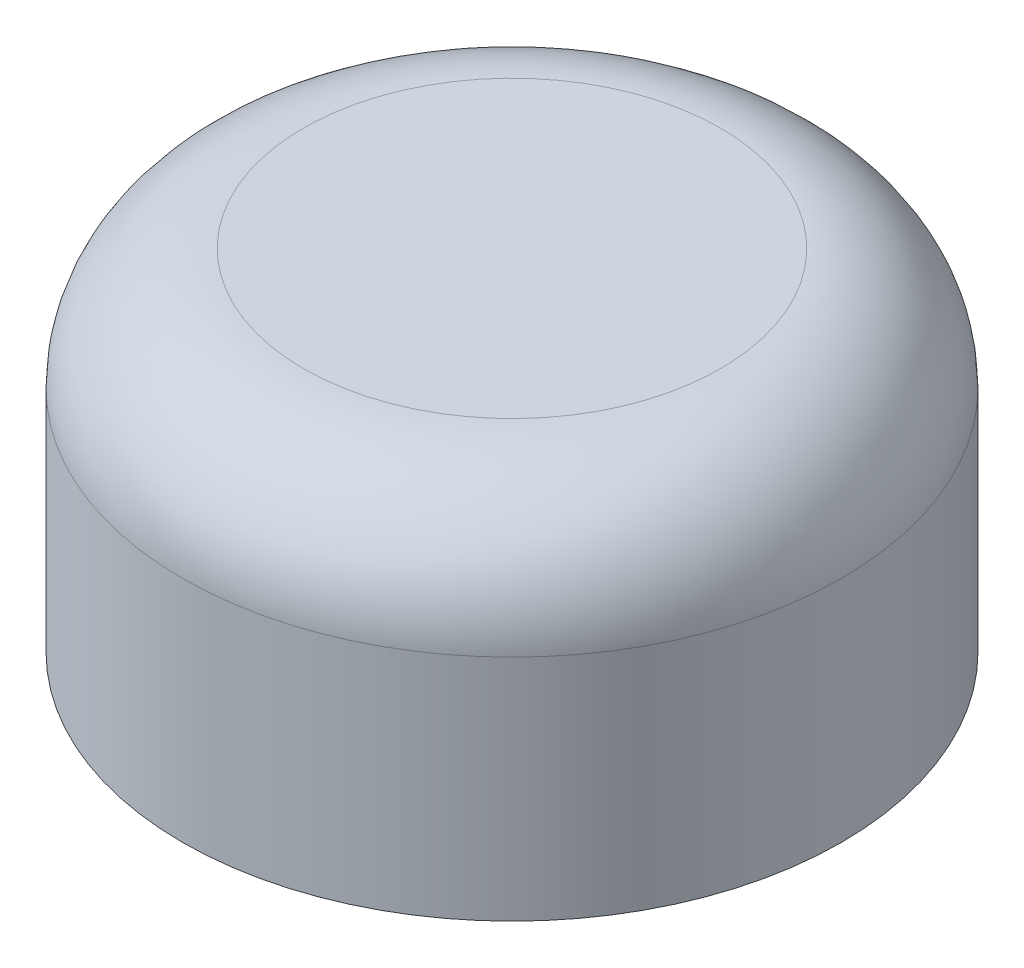
ISO-10303-21;
HEADER;
FILE_DESCRIPTION(('STEP AP214'),'2;1');
FILE_NAME('part.step','',(''),(''),'','','');
FILE_SCHEMA(('AUTOMOTIVE_DESIGN { 1 0 10303 214 1 1 1 1 }'));
ENDSEC;
DATA;
#1=APPLICATION_CONTEXT('core data for automotive mechanical design processes');
#2=APPLICATION_PROTOCOL_DEFINITION('international standard','automotive_design',2000,#1);
#3=PRODUCT_CONTEXT('',#1,'mechanical');
#4=PRODUCT('Part','Part','',(#3));
#5=PRODUCT_RELATED_PRODUCT_CATEGORY('part','',(#4));
#6=PRODUCT_DEFINITION_FORMATION('','',#4);
#7=PRODUCT_DEFINITION_CONTEXT('part definition',#1,'design');
#8=PRODUCT_DEFINITION('design','',#6,#7);
#9=PRODUCT_DEFINITION_SHAPE('','',#8);
#10=(LENGTH_UNIT() NAMED_UNIT(*) SI_UNIT(.MILLI.,.METRE.));
#11=(NAMED_UNIT(*) PLANE_ANGLE_UNIT() SI_UNIT($,.RADIAN.));
#12=(NAMED_UNIT(*) SI_UNIT($,.STERADIAN.) SOLID_ANGLE_UNIT());
#13=UNCERTAINTY_MEASURE_WITH_UNIT(LENGTH_MEASURE(1.E-05),#10,'distance_accuracy_value','');
#14=(GEOMETRIC_REPRESENTATION_CONTEXT(3) GLOBAL_UNCERTAINTY_ASSIGNED_CONTEXT((#13)) GLOBAL_UNIT_ASSIGNED_CONTEXT((#10,
#11,#12)) REPRESENTATION_CONTEXT('',''));
#15=CARTESIAN_POINT('',(0.,0.,0.));
#16=DIRECTION('',(0.,0.,1.));
#17=DIRECTION('',(1.,0.,0.));
#18=AXIS2_PLACEMENT_3D('',#15,#16,#17);
#19=CARTESIAN_POINT('',(0.,22.6982613348676,0.));
#20=DIRECTION('',(0.,-1.,0.));
#21=DIRECTION('',(0.,0.,-1.));
#22=AXIS2_PLACEMENT_3D('',#19,#20,#21);
#23=PLANE('',#22);
#24=CARTESIAN_POINT('',(0.,22.6982613348676,0.));
#25=DIRECTION('',(0.,-1.,0.));
#26=DIRECTION('',(0.,0.,-1.));
#27=AXIS2_PLACEMENT_3D('',#24,#25,#26);
#28=CIRCLE('',#27,7.874);
#29=CARTESIAN_POINT('',(0.,22.6982613348676,-7.874));
#30=VERTEX_POINT('',#29);
#31=EDGE_CURVE('E10',#30,#30,#28,.F.);
#32=ORIENTED_EDGE('',*,*,#31,.T.);
#33=EDGE_LOOP('',(#32));
#34=FACE_BOUND('',#33,.T.);
#35=ADVANCED_FACE('F32',(#34),#23,.F.);
#36=CARTESIAN_POINT('',(0.,0.,0.));
#37=DIRECTION('',(0.,-1.,0.));
#38=DIRECTION('',(0.,0.,-1.));
#39=AXIS2_PLACEMENT_3D('',#36,#37,#38);
#40=CYLINDRICAL_SURFACE('',#39,12.446);
#41=CARTESIAN_POINT('',(0.,18.1262613348676,0.));
#42=DIRECTION('',(0.,-1.,0.));
#43=DIRECTION('',(0.,0.,-1.));
#44=AXIS2_PLACEMENT_3D('',#41,#42,#43);
#45=CIRCLE('',#44,12.446);
#46=CARTESIAN_POINT('',(0.,18.1262613348676,-12.446));
#47=VERTEX_POINT('',#46);
#48=EDGE_CURVE('E39',#47,#47,#45,.T.);
#49=ORIENTED_EDGE('',*,*,#48,.T.);
#50=EDGE_LOOP('',(#49));
#51=FACE_BOUND('',#50,.T.);
#52=CARTESIAN_POINT('',(0.,9.49026133486765,0.));
#53=DIRECTION('',(0.,-1.,0.));
#54=DIRECTION('',(0.,0.,-1.));
#55=AXIS2_PLACEMENT_3D('',#52,#53,#54);
#56=CIRCLE('',#55,12.446);
#57=CARTESIAN_POINT('',(0.,9.49026133486765,-12.446));
#58=VERTEX_POINT('',#57);
#59=EDGE_CURVE('E56',#58,#58,#56,.T.);
#60=ORIENTED_EDGE('',*,*,#59,.F.);
#61=EDGE_LOOP('',(#60));
#62=FACE_BOUND('',#61,.T.);
#63=ADVANCED_FACE('F87',(#51,#62),#40,.T.);
#64=CARTESIAN_POINT('',(12.446,9.49026133486765,0.));
#65=DIRECTION('',(0.,1.,0.));
#66=DIRECTION('',(0.,0.,1.));
#67=AXIS2_PLACEMENT_3D('',#64,#65,#66);
#68=PLANE('',#67);
#69=CARTESIAN_POINT('',(0.,9.49026133486765,0.));
#70=DIRECTION('',(0.,-1.,0.));
#71=DIRECTION('',(0.,0.,-1.));
#72=AXIS2_PLACEMENT_3D('',#69,#70,#71);
#73=CIRCLE('',#72,10.16);
#74=CARTESIAN_POINT('',(0.,9.49026133486765,-10.16));
#75=VERTEX_POINT('',#74);
#76=EDGE_CURVE('E60',#75,#75,#73,.T.);
#77=ORIENTED_EDGE('',*,*,#76,.F.);
#78=EDGE_LOOP('',(#77));
#79=FACE_BOUND('',#78,.T.);
#80=ORIENTED_EDGE('',*,*,#59,.T.);
#81=EDGE_LOOP('',(#80));
#82=FACE_BOUND('',#81,.T.);
#83=ADVANCED_FACE('F81',(#79,#82),#68,.F.);
#84=CARTESIAN_POINT('',(0.,0.,0.));
#85=DIRECTION('',(0.,-1.,0.));
#86=DIRECTION('',(0.,0.,-1.));
#87=AXIS2_PLACEMENT_3D('',#84,#85,#86);
#88=CYLINDRICAL_SURFACE('',#87,10.16);
#89=CARTESIAN_POINT('',(0.,10.7602613348676,0.));
#90=DIRECTION('',(0.,-1.,0.));
#91=DIRECTION('',(0.,0.,-1.));
#92=AXIS2_PLACEMENT_3D('',#89,#90,#91);
#93=CIRCLE('',#92,10.16);
#94=CARTESIAN_POINT('',(0.,10.7602613348676,-10.16));
#95=VERTEX_POINT('',#94);
#96=EDGE_CURVE('E63',#95,#95,#93,.T.);
#97=ORIENTED_EDGE('',*,*,#96,.F.);
#98=EDGE_LOOP('',(#97));
#99=FACE_BOUND('',#98,.T.);
#100=ORIENTED_EDGE('',*,*,#76,.T.);
#101=EDGE_LOOP('',(#100));
#102=FACE_BOUND('',#101,.T.);
#103=ADVANCED_FACE('F75',(#99,#102),#88,.F.);
#104=CARTESIAN_POINT('',(10.16,10.7602613348676,0.));
#105=DIRECTION('',(0.,-1.,0.));
#106=DIRECTION('',(0.,0.,-1.));
#107=AXIS2_PLACEMENT_3D('',#104,#105,#106);
#108=PLANE('',#107);
#109=CARTESIAN_POINT('',(0.,10.7602613348676,0.));
#110=DIRECTION('',(0.,-1.,0.));
#111=DIRECTION('',(0.,0.,-1.));
#112=AXIS2_PLACEMENT_3D('',#109,#110,#111);
#113=CIRCLE('',#112,11.684);
#114=CARTESIAN_POINT('',(0.,10.7602613348676,-11.684));
#115=VERTEX_POINT('',#114);
#116=EDGE_CURVE('E66',#115,#115,#113,.T.);
#117=ORIENTED_EDGE('',*,*,#116,.F.);
#118=EDGE_LOOP('',(#117));
#119=FACE_BOUND('',#118,.T.);
#120=ORIENTED_EDGE('',*,*,#96,.T.);
#121=EDGE_LOOP('',(#120));
#122=FACE_BOUND('',#121,.T.);
#123=ADVANCED_FACE('F72',(#119,#122),#108,.F.);
#124=CARTESIAN_POINT('',(0.,0.,0.));
#125=DIRECTION('',(0.,-1.,0.));
#126=DIRECTION('',(0.,0.,-1.));
#127=AXIS2_PLACEMENT_3D('',#124,#125,#126);
#128=CYLINDRICAL_SURFACE('',#127,11.684);
#129=CARTESIAN_POINT('',(0.,17.6182613348676,0.));
#130=DIRECTION('',(0.,1.,0.));
#131=DIRECTION('',(0.,0.,1.));
#132=AXIS2_PLACEMENT_3D('',#129,#130,#131);
#133=CIRCLE('',#132,11.684);
#134=CARTESIAN_POINT('',(0.,17.6182613348676,11.684));
#135=VERTEX_POINT('',#134);
#136=EDGE_CURVE('E44',#135,#135,#133,.T.);
#137=ORIENTED_EDGE('',*,*,#136,.T.);
#138=EDGE_LOOP('',(#137));
#139=FACE_BOUND('',#138,.T.);
#140=ORIENTED_EDGE('',*,*,#116,.T.);
#141=EDGE_LOOP('',(#140));
#142=FACE_BOUND('',#141,.T.);
#143=ADVANCED_FACE('F70',(#139,#142),#128,.F.);
#144=CARTESIAN_POINT('',(11.684,21.4282613348676,0.));
#145=DIRECTION('',(0.,1.,0.));
#146=DIRECTION('',(0.,0.,1.));
#147=AXIS2_PLACEMENT_3D('',#144,#145,#146);
#148=PLANE('',#147);
#149=CARTESIAN_POINT('',(0.,21.4282613348676,0.));
#150=DIRECTION('',(0.,1.,0.));
#151=DIRECTION('',(0.,0.,1.));
#152=AXIS2_PLACEMENT_3D('',#149,#150,#151);
#153=CIRCLE('',#152,7.874);
#154=CARTESIAN_POINT('',(0.,21.4282613348676,7.874));
#155=VERTEX_POINT('',#154);
#156=EDGE_CURVE('E51',#155,#155,#153,.F.);
#157=ORIENTED_EDGE('',*,*,#156,.T.);
#158=EDGE_LOOP('',(#157));
#159=FACE_BOUND('',#158,.T.);
#160=ADVANCED_FACE('F98',(#159),#148,.F.);
#161=CARTESIAN_POINT('',(0.,17.6182613348676,0.));
#162=DIRECTION('',(0.,1.,0.));
#163=DIRECTION('',(0.,0.,1.));
#164=AXIS2_PLACEMENT_3D('',#161,#162,#163);
#165=TOROIDAL_SURFACE('',#164,7.874,3.81);
#166=ORIENTED_EDGE('',*,*,#136,.F.);
#167=EDGE_LOOP('',(#166));
#168=FACE_BOUND('',#167,.T.);
#169=ORIENTED_EDGE('',*,*,#156,.F.);
#170=EDGE_LOOP('',(#169));
#171=FACE_BOUND('',#170,.T.);
#172=ADVANCED_FACE('F96',(#168,#171),#165,.F.);
#173=CARTESIAN_POINT('',(0.,18.1262613348676,0.));
#174=DIRECTION('',(0.,-1.,0.));
#175=DIRECTION('',(0.,0.,-1.));
#176=AXIS2_PLACEMENT_3D('',#173,#174,#175);
#177=TOROIDAL_SURFACE('',#176,7.874,4.572);
#178=ORIENTED_EDGE('',*,*,#31,.F.);
#179=EDGE_LOOP('',(#178));
#180=FACE_BOUND('',#179,.T.);
#181=ORIENTED_EDGE('',*,*,#48,.F.);
#182=EDGE_LOOP('',(#181));
#183=FACE_BOUND('',#182,.T.);
#184=ADVANCED_FACE('F34',(#180,#183),#177,.T.);
#185=CLOSED_SHELL('',(#35,#63,#83,#103,#123,#143,#160,#172,#184));
#186=MANIFOLD_SOLID_BREP('B2',#185);
#187=ADVANCED_BREP_SHAPE_REPRESENTATION('',(#18,#186),#14);
#188=SHAPE_DEFINITION_REPRESENTATION(#9,#187);
ENDSEC;
END-ISO-10303-21;
